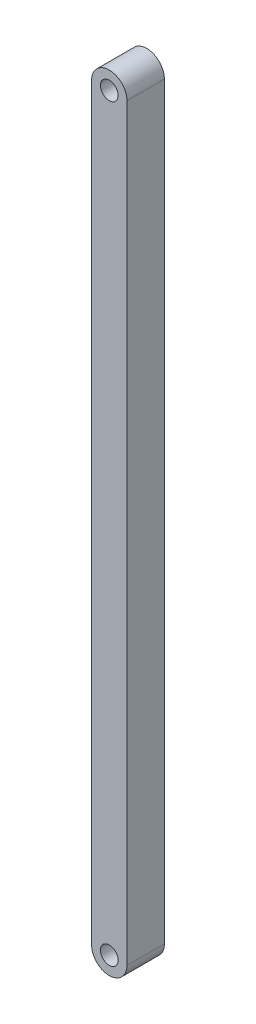
ISO-10303-21;
HEADER;
FILE_DESCRIPTION(('STEP AP214'),'2;1');
FILE_NAME('part.step','',(''),(''),'','','');
FILE_SCHEMA(('AUTOMOTIVE_DESIGN { 1 0 10303 214 1 1 1 1 }'));
ENDSEC;
DATA;
#1=APPLICATION_CONTEXT('core data for automotive mechanical design processes');
#2=APPLICATION_PROTOCOL_DEFINITION('international standard','automotive_design',2000,#1);
#3=PRODUCT_CONTEXT('',#1,'mechanical');
#4=PRODUCT('Part','Part','',(#3));
#5=PRODUCT_RELATED_PRODUCT_CATEGORY('part','',(#4));
#6=PRODUCT_DEFINITION_FORMATION('','',#4);
#7=PRODUCT_DEFINITION_CONTEXT('part definition',#1,'design');
#8=PRODUCT_DEFINITION('design','',#6,#7);
#9=PRODUCT_DEFINITION_SHAPE('','',#8);
#10=(LENGTH_UNIT() NAMED_UNIT(*) SI_UNIT(.MILLI.,.METRE.));
#11=(NAMED_UNIT(*) PLANE_ANGLE_UNIT() SI_UNIT($,.RADIAN.));
#12=(NAMED_UNIT(*) SI_UNIT($,.STERADIAN.) SOLID_ANGLE_UNIT());
#13=UNCERTAINTY_MEASURE_WITH_UNIT(LENGTH_MEASURE(1.E-05),#10,'distance_accuracy_value','');
#14=(GEOMETRIC_REPRESENTATION_CONTEXT(3) GLOBAL_UNCERTAINTY_ASSIGNED_CONTEXT((#13)) GLOBAL_UNIT_ASSIGNED_CONTEXT((#10,
#11,#12)) REPRESENTATION_CONTEXT('',''));
#15=CARTESIAN_POINT('',(0.,0.,0.));
#16=DIRECTION('',(0.,0.,1.));
#17=DIRECTION('',(1.,0.,0.));
#18=AXIS2_PLACEMENT_3D('',#15,#16,#17);
#19=CARTESIAN_POINT('',(0.,-254.,12.7));
#20=DIRECTION('',(0.,0.,1.));
#21=DIRECTION('',(1.,0.,0.));
#22=AXIS2_PLACEMENT_3D('',#19,#20,#21);
#23=PLANE('',#22);
#24=CARTESIAN_POINT('',(0.,0.,12.7));
#25=DIRECTION('',(0.,0.,1.));
#26=DIRECTION('',(1.,0.,0.));
#27=AXIS2_PLACEMENT_3D('',#24,#25,#26);
#28=CIRCLE('',#27,3.);
#29=CARTESIAN_POINT('',(3.,0.,12.7));
#30=VERTEX_POINT('',#29);
#31=EDGE_CURVE('E114',#30,#30,#28,.T.);
#32=ORIENTED_EDGE('',*,*,#31,.F.);
#33=EDGE_LOOP('',(#32));
#34=FACE_BOUND('',#33,.T.);
#35=CARTESIAN_POINT('',(0.,-254.,12.7));
#36=DIRECTION('',(0.,0.,1.));
#37=DIRECTION('',(1.,0.,0.));
#38=AXIS2_PLACEMENT_3D('',#35,#36,#37);
#39=CIRCLE('',#38,5.99999999999997);
#40=CARTESIAN_POINT('',(-5.99999999999997,-254.,12.7));
#41=VERTEX_POINT('',#40);
#42=CARTESIAN_POINT('',(5.99999999999997,-254.,12.7));
#43=VERTEX_POINT('',#42);
#44=EDGE_CURVE('E94',#41,#43,#39,.T.);
#45=ORIENTED_EDGE('',*,*,#44,.T.);
#46=DIRECTION('',(0.,1.,0.));
#47=VECTOR('',#46,1.);
#48=CARTESIAN_POINT('',(5.99999999999997,0.,12.7));
#49=LINE('',#48,#47);
#50=CARTESIAN_POINT('',(5.99999999999997,0.,12.7));
#51=VERTEX_POINT('',#50);
#52=EDGE_CURVE('E89',#43,#51,#49,.T.);
#53=ORIENTED_EDGE('',*,*,#52,.T.);
#54=CARTESIAN_POINT('',(0.,0.,12.7));
#55=DIRECTION('',(0.,0.,1.));
#56=DIRECTION('',(1.,0.,0.));
#57=AXIS2_PLACEMENT_3D('',#54,#55,#56);
#58=CIRCLE('',#57,5.99999999999997);
#59=CARTESIAN_POINT('',(-5.99999999999997,0.,12.7));
#60=VERTEX_POINT('',#59);
#61=EDGE_CURVE('E92',#51,#60,#58,.T.);
#62=ORIENTED_EDGE('',*,*,#61,.T.);
#63=DIRECTION('',(0.,-1.,0.));
#64=VECTOR('',#63,1.);
#65=CARTESIAN_POINT('',(-5.99999999999997,-254.,12.7));
#66=LINE('',#65,#64);
#67=EDGE_CURVE('E59',#60,#41,#66,.T.);
#68=ORIENTED_EDGE('',*,*,#67,.T.);
#69=EDGE_LOOP('',(#45,#53,#62,#68));
#70=FACE_BOUND('',#69,.T.);
#71=CARTESIAN_POINT('',(0.,-254.,12.7));
#72=DIRECTION('',(0.,0.,1.));
#73=DIRECTION('',(1.,0.,0.));
#74=AXIS2_PLACEMENT_3D('',#71,#72,#73);
#75=CIRCLE('',#74,3.);
#76=CARTESIAN_POINT('',(3.,-254.,12.7));
#77=VERTEX_POINT('',#76);
#78=EDGE_CURVE('E136',#77,#77,#75,.T.);
#79=ORIENTED_EDGE('',*,*,#78,.F.);
#80=EDGE_LOOP('',(#79));
#81=FACE_BOUND('',#80,.T.);
#82=ADVANCED_FACE('F41',(#34,#70,#81),#23,.T.);
#83=CARTESIAN_POINT('',(0.,-254.,0.));
#84=DIRECTION('',(0.,0.,1.));
#85=DIRECTION('',(1.,0.,0.));
#86=AXIS2_PLACEMENT_3D('',#83,#84,#85);
#87=PLANE('',#86);
#88=CARTESIAN_POINT('',(0.,-254.,0.));
#89=DIRECTION('',(0.,0.,1.));
#90=DIRECTION('',(1.,0.,0.));
#91=AXIS2_PLACEMENT_3D('',#88,#89,#90);
#92=CIRCLE('',#91,5.99999999999997);
#93=CARTESIAN_POINT('',(-5.99999999999997,-254.,0.));
#94=VERTEX_POINT('',#93);
#95=CARTESIAN_POINT('',(5.99999999999997,-254.,0.));
#96=VERTEX_POINT('',#95);
#97=EDGE_CURVE('E110',#94,#96,#92,.T.);
#98=ORIENTED_EDGE('',*,*,#97,.F.);
#99=DIRECTION('',(0.,-1.,0.));
#100=VECTOR('',#99,1.);
#101=CARTESIAN_POINT('',(-5.99999999999997,-254.,0.));
#102=LINE('',#101,#100);
#103=CARTESIAN_POINT('',(-5.99999999999997,0.,0.));
#104=VERTEX_POINT('',#103);
#105=EDGE_CURVE('E82',#104,#94,#102,.T.);
#106=ORIENTED_EDGE('',*,*,#105,.F.);
#107=CARTESIAN_POINT('',(0.,0.,0.));
#108=DIRECTION('',(0.,0.,1.));
#109=DIRECTION('',(1.,0.,0.));
#110=AXIS2_PLACEMENT_3D('',#107,#108,#109);
#111=CIRCLE('',#110,5.99999999999997);
#112=CARTESIAN_POINT('',(5.99999999999997,0.,0.));
#113=VERTEX_POINT('',#112);
#114=EDGE_CURVE('E76',#113,#104,#111,.T.);
#115=ORIENTED_EDGE('',*,*,#114,.F.);
#116=DIRECTION('',(0.,1.,0.));
#117=VECTOR('',#116,1.);
#118=CARTESIAN_POINT('',(5.99999999999997,0.,0.));
#119=LINE('',#118,#117);
#120=EDGE_CURVE('E99',#96,#113,#119,.T.);
#121=ORIENTED_EDGE('',*,*,#120,.F.);
#122=EDGE_LOOP('',(#98,#106,#115,#121));
#123=FACE_BOUND('',#122,.T.);
#124=CARTESIAN_POINT('',(0.,0.,0.));
#125=DIRECTION('',(0.,0.,1.));
#126=DIRECTION('',(1.,0.,0.));
#127=AXIS2_PLACEMENT_3D('',#124,#125,#126);
#128=CIRCLE('',#127,3.);
#129=CARTESIAN_POINT('',(3.,0.,0.));
#130=VERTEX_POINT('',#129);
#131=EDGE_CURVE('E132',#130,#130,#128,.T.);
#132=ORIENTED_EDGE('',*,*,#131,.T.);
#133=EDGE_LOOP('',(#132));
#134=FACE_BOUND('',#133,.T.);
#135=CARTESIAN_POINT('',(0.,-254.,0.));
#136=DIRECTION('',(0.,0.,1.));
#137=DIRECTION('',(1.,0.,0.));
#138=AXIS2_PLACEMENT_3D('',#135,#136,#137);
#139=CIRCLE('',#138,3.);
#140=CARTESIAN_POINT('',(3.,-254.,0.));
#141=VERTEX_POINT('',#140);
#142=EDGE_CURVE('E140',#141,#141,#139,.T.);
#143=ORIENTED_EDGE('',*,*,#142,.T.);
#144=EDGE_LOOP('',(#143));
#145=FACE_BOUND('',#144,.T.);
#146=ADVANCED_FACE('F127',(#123,#134,#145),#87,.F.);
#147=CARTESIAN_POINT('',(0.,-254.,12.7));
#148=DIRECTION('',(0.,0.,-1.));
#149=DIRECTION('',(-1.,0.,0.));
#150=AXIS2_PLACEMENT_3D('',#147,#148,#149);
#151=CYLINDRICAL_SURFACE('',#150,5.99999999999997);
#152=ORIENTED_EDGE('',*,*,#97,.T.);
#153=DIRECTION('',(0.,0.,-1.));
#154=VECTOR('',#153,1.);
#155=CARTESIAN_POINT('',(5.99999999999997,-254.,12.7));
#156=LINE('',#155,#154);
#157=EDGE_CURVE('E11',#43,#96,#156,.T.);
#158=ORIENTED_EDGE('',*,*,#157,.F.);
#159=ORIENTED_EDGE('',*,*,#44,.F.);
#160=DIRECTION('',(0.,0.,-1.));
#161=VECTOR('',#160,1.);
#162=CARTESIAN_POINT('',(-5.99999999999997,-254.,12.7));
#163=LINE('',#162,#161);
#164=EDGE_CURVE('E106',#41,#94,#163,.T.);
#165=ORIENTED_EDGE('',*,*,#164,.T.);
#166=EDGE_LOOP('',(#152,#158,#159,#165));
#167=FACE_BOUND('',#166,.T.);
#168=ADVANCED_FACE('F43',(#167),#151,.T.);
#169=CARTESIAN_POINT('',(5.99999999999997,0.,12.7));
#170=DIRECTION('',(-1.,0.,0.));
#171=DIRECTION('',(0.,0.,1.));
#172=AXIS2_PLACEMENT_3D('',#169,#170,#171);
#173=PLANE('',#172);
#174=ORIENTED_EDGE('',*,*,#120,.T.);
#175=DIRECTION('',(0.,0.,-1.));
#176=VECTOR('',#175,1.);
#177=CARTESIAN_POINT('',(5.99999999999997,0.,12.7));
#178=LINE('',#177,#176);
#179=EDGE_CURVE('E51',#51,#113,#178,.T.);
#180=ORIENTED_EDGE('',*,*,#179,.F.);
#181=ORIENTED_EDGE('',*,*,#52,.F.);
#182=ORIENTED_EDGE('',*,*,#157,.T.);
#183=EDGE_LOOP('',(#174,#180,#181,#182));
#184=FACE_BOUND('',#183,.T.);
#185=ADVANCED_FACE('F98',(#184),#173,.F.);
#186=CARTESIAN_POINT('',(0.,0.,12.7));
#187=DIRECTION('',(0.,0.,-1.));
#188=DIRECTION('',(-1.,0.,0.));
#189=AXIS2_PLACEMENT_3D('',#186,#187,#188);
#190=CYLINDRICAL_SURFACE('',#189,5.99999999999997);
#191=ORIENTED_EDGE('',*,*,#114,.T.);
#192=DIRECTION('',(0.,0.,-1.));
#193=VECTOR('',#192,1.);
#194=CARTESIAN_POINT('',(-5.99999999999997,0.,12.7));
#195=LINE('',#194,#193);
#196=EDGE_CURVE('E101',#60,#104,#195,.T.);
#197=ORIENTED_EDGE('',*,*,#196,.F.);
#198=ORIENTED_EDGE('',*,*,#61,.F.);
#199=ORIENTED_EDGE('',*,*,#179,.T.);
#200=EDGE_LOOP('',(#191,#197,#198,#199));
#201=FACE_BOUND('',#200,.T.);
#202=ADVANCED_FACE('F102',(#201),#190,.T.);
#203=CARTESIAN_POINT('',(-5.99999999999997,-254.,12.7));
#204=DIRECTION('',(1.,0.,0.));
#205=DIRECTION('',(0.,0.,-1.));
#206=AXIS2_PLACEMENT_3D('',#203,#204,#205);
#207=PLANE('',#206);
#208=ORIENTED_EDGE('',*,*,#105,.T.);
#209=ORIENTED_EDGE('',*,*,#164,.F.);
#210=ORIENTED_EDGE('',*,*,#67,.F.);
#211=ORIENTED_EDGE('',*,*,#196,.T.);
#212=EDGE_LOOP('',(#208,#209,#210,#211));
#213=FACE_BOUND('',#212,.T.);
#214=ADVANCED_FACE('F124',(#213),#207,.F.);
#215=CARTESIAN_POINT('',(0.,0.,12.7));
#216=DIRECTION('',(0.,0.,-1.));
#217=DIRECTION('',(-1.,0.,0.));
#218=AXIS2_PLACEMENT_3D('',#215,#216,#217);
#219=CYLINDRICAL_SURFACE('',#218,3.);
#220=ORIENTED_EDGE('',*,*,#31,.T.);
#221=EDGE_LOOP('',(#220));
#222=FACE_BOUND('',#221,.T.);
#223=ORIENTED_EDGE('',*,*,#131,.F.);
#224=EDGE_LOOP('',(#223));
#225=FACE_BOUND('',#224,.T.);
#226=ADVANCED_FACE('F159',(#222,#225),#219,.F.);
#227=CARTESIAN_POINT('',(0.,-254.,12.7));
#228=DIRECTION('',(0.,0.,-1.));
#229=DIRECTION('',(-1.,0.,0.));
#230=AXIS2_PLACEMENT_3D('',#227,#228,#229);
#231=CYLINDRICAL_SURFACE('',#230,3.);
#232=ORIENTED_EDGE('',*,*,#78,.T.);
#233=EDGE_LOOP('',(#232));
#234=FACE_BOUND('',#233,.T.);
#235=ORIENTED_EDGE('',*,*,#142,.F.);
#236=EDGE_LOOP('',(#235));
#237=FACE_BOUND('',#236,.T.);
#238=ADVANCED_FACE('F148',(#234,#237),#231,.F.);
#239=CLOSED_SHELL('',(#82,#146,#168,#185,#202,#214,#226,#238));
#240=MANIFOLD_SOLID_BREP('B2',#239);
#241=ADVANCED_BREP_SHAPE_REPRESENTATION('',(#18,#240),#14);
#242=SHAPE_DEFINITION_REPRESENTATION(#9,#241);
ENDSEC;
END-ISO-10303-21;
